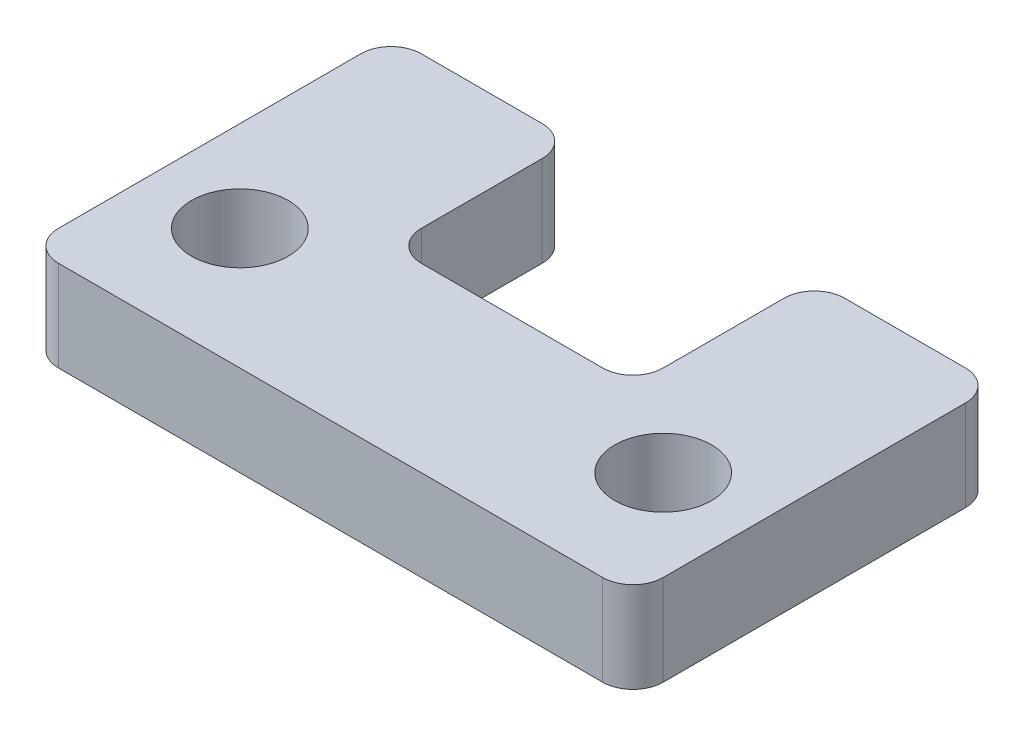
ISO-10303-21;
HEADER;
FILE_DESCRIPTION(('STEP AP214'),'2;1');
FILE_NAME('part.step','',(''),(''),'','','');
FILE_SCHEMA(('AUTOMOTIVE_DESIGN { 1 0 10303 214 1 1 1 1 }'));
ENDSEC;
DATA;
#1=APPLICATION_CONTEXT('core data for automotive mechanical design processes');
#2=APPLICATION_PROTOCOL_DEFINITION('international standard','automotive_design',2000,#1);
#3=PRODUCT_CONTEXT('',#1,'mechanical');
#4=PRODUCT('Part','Part','',(#3));
#5=PRODUCT_RELATED_PRODUCT_CATEGORY('part','',(#4));
#6=PRODUCT_DEFINITION_FORMATION('','',#4);
#7=PRODUCT_DEFINITION_CONTEXT('part definition',#1,'design');
#8=PRODUCT_DEFINITION('design','',#6,#7);
#9=PRODUCT_DEFINITION_SHAPE('','',#8);
#10=(LENGTH_UNIT() NAMED_UNIT(*) SI_UNIT(.MILLI.,.METRE.));
#11=(NAMED_UNIT(*) PLANE_ANGLE_UNIT() SI_UNIT($,.RADIAN.));
#12=(NAMED_UNIT(*) SI_UNIT($,.STERADIAN.) SOLID_ANGLE_UNIT());
#13=UNCERTAINTY_MEASURE_WITH_UNIT(LENGTH_MEASURE(1.E-05),#10,'distance_accuracy_value','');
#14=(GEOMETRIC_REPRESENTATION_CONTEXT(3) GLOBAL_UNCERTAINTY_ASSIGNED_CONTEXT((#13)) GLOBAL_UNIT_ASSIGNED_CONTEXT((#10,
#11,#12)) REPRESENTATION_CONTEXT('',''));
#15=CARTESIAN_POINT('',(0.,0.,0.));
#16=DIRECTION('',(0.,0.,1.));
#17=DIRECTION('',(1.,0.,0.));
#18=AXIS2_PLACEMENT_3D('',#15,#16,#17);
#19=CARTESIAN_POINT('',(0.,3.,0.));
#20=DIRECTION('',(0.,-1.,0.));
#21=DIRECTION('',(0.,0.,-1.));
#22=AXIS2_PLACEMENT_3D('',#19,#20,#21);
#23=PLANE('',#22);
#24=DIRECTION('',(0.,0.,-1.));
#25=VECTOR('',#24,1.);
#26=CARTESIAN_POINT('',(-4.,3.,-12.));
#27=LINE('',#26,#25);
#28=CARTESIAN_POINT('',(-4.,3.,-7.00000000000001));
#29=VERTEX_POINT('',#28);
#30=CARTESIAN_POINT('',(-4.,3.,-11.));
#31=VERTEX_POINT('',#30);
#32=EDGE_CURVE('E186',#29,#31,#27,.T.);
#33=ORIENTED_EDGE('',*,*,#32,.T.);
#34=CARTESIAN_POINT('',(-5.,3.,-11.));
#35=DIRECTION('',(0.,-1.,0.));
#36=DIRECTION('',(0.,0.,-1.));
#37=AXIS2_PLACEMENT_3D('',#34,#35,#36);
#38=CIRCLE('',#37,1.);
#39=CARTESIAN_POINT('',(-5.,3.,-12.));
#40=VERTEX_POINT('',#39);
#41=EDGE_CURVE('E225',#31,#40,#38,.F.);
#42=ORIENTED_EDGE('',*,*,#41,.T.);
#43=DIRECTION('',(-1.,0.,0.));
#44=VECTOR('',#43,1.);
#45=CARTESIAN_POINT('',(-10.,3.,-12.));
#46=LINE('',#45,#44);
#47=CARTESIAN_POINT('',(-9.,3.,-12.));
#48=VERTEX_POINT('',#47);
#49=EDGE_CURVE('E168',#40,#48,#46,.T.);
#50=ORIENTED_EDGE('',*,*,#49,.T.);
#51=CARTESIAN_POINT('',(-9.,3.,-11.));
#52=DIRECTION('',(0.,-1.,0.));
#53=DIRECTION('',(0.,0.,-1.));
#54=AXIS2_PLACEMENT_3D('',#51,#52,#53);
#55=CIRCLE('',#54,1.);
#56=CARTESIAN_POINT('',(-10.,3.,-11.));
#57=VERTEX_POINT('',#56);
#58=EDGE_CURVE('E217',#48,#57,#55,.F.);
#59=ORIENTED_EDGE('',*,*,#58,.T.);
#60=DIRECTION('',(0.,0.,1.));
#61=VECTOR('',#60,1.);
#62=CARTESIAN_POINT('',(-10.,3.,0.));
#63=LINE('',#62,#61);
#64=CARTESIAN_POINT('',(-10.,3.,-0.999999999999997));
#65=VERTEX_POINT('',#64);
#66=EDGE_CURVE('E285',#57,#65,#63,.T.);
#67=ORIENTED_EDGE('',*,*,#66,.T.);
#68=CARTESIAN_POINT('',(-9.,3.,-0.999999999999998));
#69=DIRECTION('',(0.,-1.,0.));
#70=DIRECTION('',(0.,0.,-1.));
#71=AXIS2_PLACEMENT_3D('',#68,#69,#70);
#72=CIRCLE('',#71,1.);
#73=CARTESIAN_POINT('',(-9.,3.,0.));
#74=VERTEX_POINT('',#73);
#75=EDGE_CURVE('E219',#65,#74,#72,.F.);
#76=ORIENTED_EDGE('',*,*,#75,.T.);
#77=DIRECTION('',(1.,0.,0.));
#78=VECTOR('',#77,1.);
#79=CARTESIAN_POINT('',(-10.,3.,0.));
#80=LINE('',#79,#78);
#81=CARTESIAN_POINT('',(9.00000000000001,3.,0.));
#82=VERTEX_POINT('',#81);
#83=EDGE_CURVE('E282',#74,#82,#80,.T.);
#84=ORIENTED_EDGE('',*,*,#83,.T.);
#85=CARTESIAN_POINT('',(9.00000000000001,3.,-1.));
#86=DIRECTION('',(0.,-1.,0.));
#87=DIRECTION('',(0.,0.,-1.));
#88=AXIS2_PLACEMENT_3D('',#85,#86,#87);
#89=CIRCLE('',#88,1.);
#90=CARTESIAN_POINT('',(10.,3.,-0.999999999999999));
#91=VERTEX_POINT('',#90);
#92=EDGE_CURVE('E215',#82,#91,#89,.F.);
#93=ORIENTED_EDGE('',*,*,#92,.T.);
#94=DIRECTION('',(0.,0.,-1.));
#95=VECTOR('',#94,1.);
#96=CARTESIAN_POINT('',(10.,3.,0.));
#97=LINE('',#96,#95);
#98=CARTESIAN_POINT('',(10.,3.,-11.));
#99=VERTEX_POINT('',#98);
#100=EDGE_CURVE('E279',#91,#99,#97,.T.);
#101=ORIENTED_EDGE('',*,*,#100,.T.);
#102=CARTESIAN_POINT('',(9.00000000000001,3.,-11.));
#103=DIRECTION('',(0.,-1.,0.));
#104=DIRECTION('',(0.,0.,-1.));
#105=AXIS2_PLACEMENT_3D('',#102,#103,#104);
#106=CIRCLE('',#105,1.);
#107=CARTESIAN_POINT('',(9.00000000000001,3.,-12.));
#108=VERTEX_POINT('',#107);
#109=EDGE_CURVE('E221',#99,#108,#106,.F.);
#110=ORIENTED_EDGE('',*,*,#109,.T.);
#111=DIRECTION('',(-1.,0.,0.));
#112=VECTOR('',#111,1.);
#113=CARTESIAN_POINT('',(10.,3.,-12.));
#114=LINE('',#113,#112);
#115=CARTESIAN_POINT('',(5.,3.,-12.));
#116=VERTEX_POINT('',#115);
#117=EDGE_CURVE('E274',#108,#116,#114,.T.);
#118=ORIENTED_EDGE('',*,*,#117,.T.);
#119=CARTESIAN_POINT('',(5.,3.,-11.));
#120=DIRECTION('',(0.,-1.,0.));
#121=DIRECTION('',(0.,0.,-1.));
#122=AXIS2_PLACEMENT_3D('',#119,#120,#121);
#123=CIRCLE('',#122,1.);
#124=CARTESIAN_POINT('',(4.,3.,-11.));
#125=VERTEX_POINT('',#124);
#126=EDGE_CURVE('E223',#116,#125,#123,.F.);
#127=ORIENTED_EDGE('',*,*,#126,.T.);
#128=DIRECTION('',(0.,0.,1.));
#129=VECTOR('',#128,1.);
#130=CARTESIAN_POINT('',(4.,3.,-12.));
#131=LINE('',#130,#129);
#132=CARTESIAN_POINT('',(4.,3.,-7.00000000000001));
#133=VERTEX_POINT('',#132);
#134=EDGE_CURVE('E272',#125,#133,#131,.T.);
#135=ORIENTED_EDGE('',*,*,#134,.T.);
#136=CARTESIAN_POINT('',(3.,3.,-7.00000000000001));
#137=DIRECTION('',(0.,-1.,0.));
#138=DIRECTION('',(0.,0.,-1.));
#139=AXIS2_PLACEMENT_3D('',#136,#137,#138);
#140=CIRCLE('',#139,1.);
#141=CARTESIAN_POINT('',(3.,3.,-6.00000000000001));
#142=VERTEX_POINT('',#141);
#143=EDGE_CURVE('E11',#133,#142,#140,.T.);
#144=ORIENTED_EDGE('',*,*,#143,.T.);
#145=DIRECTION('',(-1.,0.,0.));
#146=VECTOR('',#145,1.);
#147=CARTESIAN_POINT('',(4.,3.,-6.00000000000001));
#148=LINE('',#147,#146);
#149=CARTESIAN_POINT('',(-3.,3.,-6.00000000000001));
#150=VERTEX_POINT('',#149);
#151=EDGE_CURVE('E270',#142,#150,#148,.T.);
#152=ORIENTED_EDGE('',*,*,#151,.T.);
#153=CARTESIAN_POINT('',(-3.,3.,-7.00000000000001));
#154=DIRECTION('',(0.,-1.,0.));
#155=DIRECTION('',(0.,0.,-1.));
#156=AXIS2_PLACEMENT_3D('',#153,#154,#155);
#157=CIRCLE('',#156,1.);
#158=EDGE_CURVE('E258',#150,#29,#157,.T.);
#159=ORIENTED_EDGE('',*,*,#158,.T.);
#160=EDGE_LOOP('',(#33,#42,#50,#59,#67,#76,#84,#93,#101,#110,#118,#127,#135,#144,#152,#159));
#161=FACE_BOUND('',#160,.T.);
#162=CARTESIAN_POINT('',(7.,3.,-4.00000000000001));
#163=DIRECTION('',(0.,1.,0.));
#164=DIRECTION('',(0.,0.,1.));
#165=AXIS2_PLACEMENT_3D('',#162,#163,#164);
#166=CIRCLE('',#165,1.6);
#167=CARTESIAN_POINT('',(7.,3.,-2.40000000000001));
#168=VERTEX_POINT('',#167);
#169=EDGE_CURVE('E177',#168,#168,#166,.T.);
#170=ORIENTED_EDGE('',*,*,#169,.F.);
#171=EDGE_LOOP('',(#170));
#172=FACE_BOUND('',#171,.T.);
#173=CARTESIAN_POINT('',(-7.,3.,-4.00000000000001));
#174=DIRECTION('',(0.,1.,0.));
#175=DIRECTION('',(0.,0.,-1.));
#176=AXIS2_PLACEMENT_3D('',#173,#174,#175);
#177=CIRCLE('',#176,1.6);
#178=CARTESIAN_POINT('',(-7.,3.,-5.6));
#179=VERTEX_POINT('',#178);
#180=EDGE_CURVE('E290',#179,#179,#177,.T.);
#181=ORIENTED_EDGE('',*,*,#180,.F.);
#182=EDGE_LOOP('',(#181));
#183=FACE_BOUND('',#182,.T.);
#184=ADVANCED_FACE('F35',(#161,#172,#183),#23,.F.);
#185=CARTESIAN_POINT('',(0.,0.,0.));
#186=DIRECTION('',(0.,-1.,0.));
#187=DIRECTION('',(0.,0.,-1.));
#188=AXIS2_PLACEMENT_3D('',#185,#186,#187);
#189=PLANE('',#188);
#190=CARTESIAN_POINT('',(7.,0.,-4.00000000000001));
#191=DIRECTION('',(0.,1.,0.));
#192=DIRECTION('',(0.,0.,1.));
#193=AXIS2_PLACEMENT_3D('',#190,#191,#192);
#194=CIRCLE('',#193,1.6);
#195=CARTESIAN_POINT('',(7.,0.,-2.40000000000001));
#196=VERTEX_POINT('',#195);
#197=EDGE_CURVE('E183',#196,#196,#194,.T.);
#198=ORIENTED_EDGE('',*,*,#197,.T.);
#199=EDGE_LOOP('',(#198));
#200=FACE_BOUND('',#199,.T.);
#201=DIRECTION('',(-1.,0.,0.));
#202=VECTOR('',#201,1.);
#203=CARTESIAN_POINT('',(-10.,0.,-12.));
#204=LINE('',#203,#202);
#205=CARTESIAN_POINT('',(-5.,0.,-12.));
#206=VERTEX_POINT('',#205);
#207=CARTESIAN_POINT('',(-9.,0.,-12.));
#208=VERTEX_POINT('',#207);
#209=EDGE_CURVE('E165',#206,#208,#204,.T.);
#210=ORIENTED_EDGE('',*,*,#209,.F.);
#211=CARTESIAN_POINT('',(-5.,0.,-11.));
#212=DIRECTION('',(0.,-1.,0.));
#213=DIRECTION('',(0.,0.,-1.));
#214=AXIS2_PLACEMENT_3D('',#211,#212,#213);
#215=CIRCLE('',#214,1.);
#216=CARTESIAN_POINT('',(-4.,0.,-11.));
#217=VERTEX_POINT('',#216);
#218=EDGE_CURVE('E148',#206,#217,#215,.T.);
#219=ORIENTED_EDGE('',*,*,#218,.T.);
#220=DIRECTION('',(0.,0.,-1.));
#221=VECTOR('',#220,1.);
#222=CARTESIAN_POINT('',(-4.,0.,-12.));
#223=LINE('',#222,#221);
#224=CARTESIAN_POINT('',(-4.,0.,-7.00000000000001));
#225=VERTEX_POINT('',#224);
#226=EDGE_CURVE('E202',#225,#217,#223,.T.);
#227=ORIENTED_EDGE('',*,*,#226,.F.);
#228=CARTESIAN_POINT('',(-3.,0.,-7.00000000000001));
#229=DIRECTION('',(0.,-1.,0.));
#230=DIRECTION('',(0.,0.,-1.));
#231=AXIS2_PLACEMENT_3D('',#228,#229,#230);
#232=CIRCLE('',#231,1.);
#233=CARTESIAN_POINT('',(-3.,0.,-6.00000000000001));
#234=VERTEX_POINT('',#233);
#235=EDGE_CURVE('E256',#225,#234,#232,.F.);
#236=ORIENTED_EDGE('',*,*,#235,.T.);
#237=DIRECTION('',(-1.,0.,0.));
#238=VECTOR('',#237,1.);
#239=CARTESIAN_POINT('',(4.,0.,-6.00000000000001));
#240=LINE('',#239,#238);
#241=CARTESIAN_POINT('',(3.,0.,-6.00000000000001));
#242=VERTEX_POINT('',#241);
#243=EDGE_CURVE('E200',#242,#234,#240,.T.);
#244=ORIENTED_EDGE('',*,*,#243,.F.);
#245=CARTESIAN_POINT('',(3.,0.,-7.00000000000001));
#246=DIRECTION('',(0.,-1.,0.));
#247=DIRECTION('',(0.,0.,-1.));
#248=AXIS2_PLACEMENT_3D('',#245,#246,#247);
#249=CIRCLE('',#248,1.);
#250=CARTESIAN_POINT('',(4.,0.,-7.00000000000001));
#251=VERTEX_POINT('',#250);
#252=EDGE_CURVE('E43',#242,#251,#249,.F.);
#253=ORIENTED_EDGE('',*,*,#252,.T.);
#254=DIRECTION('',(0.,0.,1.));
#255=VECTOR('',#254,1.);
#256=CARTESIAN_POINT('',(4.,0.,-12.));
#257=LINE('',#256,#255);
#258=CARTESIAN_POINT('',(4.,0.,-11.));
#259=VERTEX_POINT('',#258);
#260=EDGE_CURVE('E197',#259,#251,#257,.T.);
#261=ORIENTED_EDGE('',*,*,#260,.F.);
#262=CARTESIAN_POINT('',(5.,0.,-11.));
#263=DIRECTION('',(0.,-1.,0.));
#264=DIRECTION('',(0.,0.,-1.));
#265=AXIS2_PLACEMENT_3D('',#262,#263,#264);
#266=CIRCLE('',#265,1.);
#267=CARTESIAN_POINT('',(5.,0.,-12.));
#268=VERTEX_POINT('',#267);
#269=EDGE_CURVE('E159',#259,#268,#266,.T.);
#270=ORIENTED_EDGE('',*,*,#269,.T.);
#271=DIRECTION('',(-1.,0.,0.));
#272=VECTOR('',#271,1.);
#273=CARTESIAN_POINT('',(10.,0.,-12.));
#274=LINE('',#273,#272);
#275=CARTESIAN_POINT('',(9.00000000000001,0.,-12.));
#276=VERTEX_POINT('',#275);
#277=EDGE_CURVE('E194',#276,#268,#274,.T.);
#278=ORIENTED_EDGE('',*,*,#277,.F.);
#279=CARTESIAN_POINT('',(9.00000000000001,0.,-11.));
#280=DIRECTION('',(0.,-1.,0.));
#281=DIRECTION('',(0.,0.,-1.));
#282=AXIS2_PLACEMENT_3D('',#279,#280,#281);
#283=CIRCLE('',#282,1.);
#284=CARTESIAN_POINT('',(10.,0.,-11.));
#285=VERTEX_POINT('',#284);
#286=EDGE_CURVE('E209',#276,#285,#283,.T.);
#287=ORIENTED_EDGE('',*,*,#286,.T.);
#288=DIRECTION('',(0.,0.,-1.));
#289=VECTOR('',#288,1.);
#290=CARTESIAN_POINT('',(10.,0.,0.));
#291=LINE('',#290,#289);
#292=CARTESIAN_POINT('',(10.,0.,-0.999999999999999));
#293=VERTEX_POINT('',#292);
#294=EDGE_CURVE('E191',#293,#285,#291,.T.);
#295=ORIENTED_EDGE('',*,*,#294,.F.);
#296=CARTESIAN_POINT('',(9.00000000000001,0.,-1.));
#297=DIRECTION('',(0.,-1.,0.));
#298=DIRECTION('',(0.,0.,-1.));
#299=AXIS2_PLACEMENT_3D('',#296,#297,#298);
#300=CIRCLE('',#299,1.);
#301=CARTESIAN_POINT('',(9.00000000000001,0.,0.));
#302=VERTEX_POINT('',#301);
#303=EDGE_CURVE('E169',#293,#302,#300,.T.);
#304=ORIENTED_EDGE('',*,*,#303,.T.);
#305=DIRECTION('',(1.,0.,0.));
#306=VECTOR('',#305,1.);
#307=CARTESIAN_POINT('',(-10.,0.,0.));
#308=LINE('',#307,#306);
#309=CARTESIAN_POINT('',(-9.,0.,0.));
#310=VERTEX_POINT('',#309);
#311=EDGE_CURVE('E180',#310,#302,#308,.T.);
#312=ORIENTED_EDGE('',*,*,#311,.F.);
#313=CARTESIAN_POINT('',(-9.,0.,-0.999999999999998));
#314=DIRECTION('',(0.,-1.,0.));
#315=DIRECTION('',(0.,0.,-1.));
#316=AXIS2_PLACEMENT_3D('',#313,#314,#315);
#317=CIRCLE('',#316,1.);
#318=CARTESIAN_POINT('',(-10.,0.,-0.999999999999997));
#319=VERTEX_POINT('',#318);
#320=EDGE_CURVE('E207',#310,#319,#317,.T.);
#321=ORIENTED_EDGE('',*,*,#320,.T.);
#322=DIRECTION('',(0.,0.,1.));
#323=VECTOR('',#322,1.);
#324=CARTESIAN_POINT('',(-10.,0.,0.));
#325=LINE('',#324,#323);
#326=CARTESIAN_POINT('',(-10.,0.,-11.));
#327=VERTEX_POINT('',#326);
#328=EDGE_CURVE('E176',#327,#319,#325,.T.);
#329=ORIENTED_EDGE('',*,*,#328,.F.);
#330=CARTESIAN_POINT('',(-9.,0.,-11.));
#331=DIRECTION('',(0.,-1.,0.));
#332=DIRECTION('',(0.,0.,-1.));
#333=AXIS2_PLACEMENT_3D('',#330,#331,#332);
#334=CIRCLE('',#333,1.);
#335=EDGE_CURVE('E175',#327,#208,#334,.T.);
#336=ORIENTED_EDGE('',*,*,#335,.T.);
#337=EDGE_LOOP('',(#210,#219,#227,#236,#244,#253,#261,#270,#278,#287,#295,#304,#312,#321,#329,#336));
#338=FACE_BOUND('',#337,.T.);
#339=CARTESIAN_POINT('',(-7.,0.,-4.00000000000001));
#340=DIRECTION('',(0.,1.,0.));
#341=DIRECTION('',(0.,0.,-1.));
#342=AXIS2_PLACEMENT_3D('',#339,#340,#341);
#343=CIRCLE('',#342,1.6);
#344=CARTESIAN_POINT('',(-7.,0.,-5.6));
#345=VERTEX_POINT('',#344);
#346=EDGE_CURVE('E292',#345,#345,#343,.T.);
#347=ORIENTED_EDGE('',*,*,#346,.T.);
#348=EDGE_LOOP('',(#347));
#349=FACE_BOUND('',#348,.T.);
#350=ADVANCED_FACE('F172',(#200,#338,#349),#189,.T.);
#351=CARTESIAN_POINT('',(-10.,3.,-12.));
#352=DIRECTION('',(0.,0.,1.));
#353=DIRECTION('',(1.,0.,0.));
#354=AXIS2_PLACEMENT_3D('',#351,#352,#353);
#355=PLANE('',#354);
#356=ORIENTED_EDGE('',*,*,#49,.F.);
#357=DIRECTION('',(0.,-1.,0.));
#358=VECTOR('',#357,1.);
#359=CARTESIAN_POINT('',(-5.,3.,-12.));
#360=LINE('',#359,#358);
#361=EDGE_CURVE('E152',#40,#206,#360,.T.);
#362=ORIENTED_EDGE('',*,*,#361,.T.);
#363=ORIENTED_EDGE('',*,*,#209,.T.);
#364=DIRECTION('',(0.,-1.,0.));
#365=VECTOR('',#364,1.);
#366=CARTESIAN_POINT('',(-9.,3.,-12.));
#367=LINE('',#366,#365);
#368=EDGE_CURVE('E170',#208,#48,#367,.F.);
#369=ORIENTED_EDGE('',*,*,#368,.T.);
#370=EDGE_LOOP('',(#356,#362,#363,#369));
#371=FACE_BOUND('',#370,.T.);
#372=ADVANCED_FACE('F164',(#371),#355,.F.);
#373=CARTESIAN_POINT('',(-10.,3.,0.));
#374=DIRECTION('',(1.,0.,0.));
#375=DIRECTION('',(0.,0.,-1.));
#376=AXIS2_PLACEMENT_3D('',#373,#374,#375);
#377=PLANE('',#376);
#378=ORIENTED_EDGE('',*,*,#328,.T.);
#379=DIRECTION('',(0.,-1.,0.));
#380=VECTOR('',#379,1.);
#381=CARTESIAN_POINT('',(-10.,3.,-0.999999999999997));
#382=LINE('',#381,#380);
#383=EDGE_CURVE('E254',#319,#65,#382,.F.);
#384=ORIENTED_EDGE('',*,*,#383,.T.);
#385=ORIENTED_EDGE('',*,*,#66,.F.);
#386=DIRECTION('',(0.,-1.,0.));
#387=VECTOR('',#386,1.);
#388=CARTESIAN_POINT('',(-10.,3.,-11.));
#389=LINE('',#388,#387);
#390=EDGE_CURVE('E251',#57,#327,#389,.T.);
#391=ORIENTED_EDGE('',*,*,#390,.T.);
#392=EDGE_LOOP('',(#378,#384,#385,#391));
#393=FACE_BOUND('',#392,.T.);
#394=ADVANCED_FACE('F332',(#393),#377,.F.);
#395=CARTESIAN_POINT('',(-10.,3.,0.));
#396=DIRECTION('',(0.,0.,-1.));
#397=DIRECTION('',(-1.,0.,0.));
#398=AXIS2_PLACEMENT_3D('',#395,#396,#397);
#399=PLANE('',#398);
#400=ORIENTED_EDGE('',*,*,#83,.F.);
#401=DIRECTION('',(0.,-1.,0.));
#402=VECTOR('',#401,1.);
#403=CARTESIAN_POINT('',(-9.,3.,0.));
#404=LINE('',#403,#402);
#405=EDGE_CURVE('E248',#74,#310,#404,.T.);
#406=ORIENTED_EDGE('',*,*,#405,.T.);
#407=ORIENTED_EDGE('',*,*,#311,.T.);
#408=DIRECTION('',(0.,-1.,0.));
#409=VECTOR('',#408,1.);
#410=CARTESIAN_POINT('',(9.00000000000001,3.,0.));
#411=LINE('',#410,#409);
#412=EDGE_CURVE('E246',#302,#82,#411,.F.);
#413=ORIENTED_EDGE('',*,*,#412,.T.);
#414=EDGE_LOOP('',(#400,#406,#407,#413));
#415=FACE_BOUND('',#414,.T.);
#416=ADVANCED_FACE('F328',(#415),#399,.F.);
#417=CARTESIAN_POINT('',(10.,3.,0.));
#418=DIRECTION('',(-1.,0.,0.));
#419=DIRECTION('',(0.,0.,1.));
#420=AXIS2_PLACEMENT_3D('',#417,#418,#419);
#421=PLANE('',#420);
#422=ORIENTED_EDGE('',*,*,#294,.T.);
#423=DIRECTION('',(0.,-1.,0.));
#424=VECTOR('',#423,1.);
#425=CARTESIAN_POINT('',(10.,3.,-11.));
#426=LINE('',#425,#424);
#427=EDGE_CURVE('E244',#285,#99,#426,.F.);
#428=ORIENTED_EDGE('',*,*,#427,.T.);
#429=ORIENTED_EDGE('',*,*,#100,.F.);
#430=DIRECTION('',(0.,-1.,0.));
#431=VECTOR('',#430,1.);
#432=CARTESIAN_POINT('',(10.,3.,-1.));
#433=LINE('',#432,#431);
#434=EDGE_CURVE('E241',#91,#293,#433,.T.);
#435=ORIENTED_EDGE('',*,*,#434,.T.);
#436=EDGE_LOOP('',(#422,#428,#429,#435));
#437=FACE_BOUND('',#436,.T.);
#438=ADVANCED_FACE('F324',(#437),#421,.F.);
#439=CARTESIAN_POINT('',(10.,3.,-12.));
#440=DIRECTION('',(0.,0.,1.));
#441=DIRECTION('',(1.,0.,0.));
#442=AXIS2_PLACEMENT_3D('',#439,#440,#441);
#443=PLANE('',#442);
#444=ORIENTED_EDGE('',*,*,#277,.T.);
#445=DIRECTION('',(0.,-1.,0.));
#446=VECTOR('',#445,1.);
#447=CARTESIAN_POINT('',(5.,3.,-12.));
#448=LINE('',#447,#446);
#449=EDGE_CURVE('E239',#268,#116,#448,.F.);
#450=ORIENTED_EDGE('',*,*,#449,.T.);
#451=ORIENTED_EDGE('',*,*,#117,.F.);
#452=DIRECTION('',(0.,-1.,0.));
#453=VECTOR('',#452,1.);
#454=CARTESIAN_POINT('',(9.00000000000001,3.,-12.));
#455=LINE('',#454,#453);
#456=EDGE_CURVE('E236',#108,#276,#455,.T.);
#457=ORIENTED_EDGE('',*,*,#456,.T.);
#458=EDGE_LOOP('',(#444,#450,#451,#457));
#459=FACE_BOUND('',#458,.T.);
#460=ADVANCED_FACE('F321',(#459),#443,.F.);
#461=CARTESIAN_POINT('',(4.,3.,-12.));
#462=DIRECTION('',(1.,0.,0.));
#463=DIRECTION('',(0.,0.,-1.));
#464=AXIS2_PLACEMENT_3D('',#461,#462,#463);
#465=PLANE('',#464);
#466=ORIENTED_EDGE('',*,*,#260,.T.);
#467=DIRECTION('',(0.,-1.,0.));
#468=VECTOR('',#467,1.);
#469=CARTESIAN_POINT('',(4.,3.,-7.00000000000001));
#470=LINE('',#469,#468);
#471=EDGE_CURVE('E234',#251,#133,#470,.F.);
#472=ORIENTED_EDGE('',*,*,#471,.T.);
#473=ORIENTED_EDGE('',*,*,#134,.F.);
#474=DIRECTION('',(0.,-1.,0.));
#475=VECTOR('',#474,1.);
#476=CARTESIAN_POINT('',(4.,3.,-11.));
#477=LINE('',#476,#475);
#478=EDGE_CURVE('E231',#125,#259,#477,.T.);
#479=ORIENTED_EDGE('',*,*,#478,.T.);
#480=EDGE_LOOP('',(#466,#472,#473,#479));
#481=FACE_BOUND('',#480,.T.);
#482=ADVANCED_FACE('F265',(#481),#465,.F.);
#483=CARTESIAN_POINT('',(4.,3.,-6.00000000000001));
#484=DIRECTION('',(0.,0.,1.));
#485=DIRECTION('',(1.,0.,0.));
#486=AXIS2_PLACEMENT_3D('',#483,#484,#485);
#487=PLANE('',#486);
#488=ORIENTED_EDGE('',*,*,#243,.T.);
#489=DIRECTION('',(0.,-1.,0.));
#490=VECTOR('',#489,1.);
#491=CARTESIAN_POINT('',(-3.,3.,-6.00000000000001));
#492=LINE('',#491,#490);
#493=EDGE_CURVE('E50',#234,#150,#492,.F.);
#494=ORIENTED_EDGE('',*,*,#493,.T.);
#495=ORIENTED_EDGE('',*,*,#151,.F.);
#496=DIRECTION('',(0.,-1.,0.));
#497=VECTOR('',#496,1.);
#498=CARTESIAN_POINT('',(3.,0.,-6.00000000000001));
#499=LINE('',#498,#497);
#500=EDGE_CURVE('E227',#142,#242,#499,.T.);
#501=ORIENTED_EDGE('',*,*,#500,.T.);
#502=EDGE_LOOP('',(#488,#494,#495,#501));
#503=FACE_BOUND('',#502,.T.);
#504=ADVANCED_FACE('F269',(#503),#487,.F.);
#505=CARTESIAN_POINT('',(-4.,3.,-12.));
#506=DIRECTION('',(-1.,0.,0.));
#507=DIRECTION('',(0.,0.,1.));
#508=AXIS2_PLACEMENT_3D('',#505,#506,#507);
#509=PLANE('',#508);
#510=ORIENTED_EDGE('',*,*,#226,.T.);
#511=DIRECTION('',(0.,-1.,0.));
#512=VECTOR('',#511,1.);
#513=CARTESIAN_POINT('',(-4.,3.,-11.));
#514=LINE('',#513,#512);
#515=EDGE_CURVE('E153',#217,#31,#514,.F.);
#516=ORIENTED_EDGE('',*,*,#515,.T.);
#517=ORIENTED_EDGE('',*,*,#32,.F.);
#518=DIRECTION('',(0.,-1.,0.));
#519=VECTOR('',#518,1.);
#520=CARTESIAN_POINT('',(-4.,0.,-7.00000000000001));
#521=LINE('',#520,#519);
#522=EDGE_CURVE('E158',#29,#225,#521,.T.);
#523=ORIENTED_EDGE('',*,*,#522,.T.);
#524=EDGE_LOOP('',(#510,#516,#517,#523));
#525=FACE_BOUND('',#524,.T.);
#526=ADVANCED_FACE('F313',(#525),#509,.F.);
#527=CARTESIAN_POINT('',(7.,3.,-4.00000000000001));
#528=DIRECTION('',(0.,-1.,0.));
#529=DIRECTION('',(0.,0.,-1.));
#530=AXIS2_PLACEMENT_3D('',#527,#528,#529);
#531=CYLINDRICAL_SURFACE('',#530,1.6);
#532=ORIENTED_EDGE('',*,*,#169,.T.);
#533=EDGE_LOOP('',(#532));
#534=FACE_BOUND('',#533,.T.);
#535=ORIENTED_EDGE('',*,*,#197,.F.);
#536=EDGE_LOOP('',(#535));
#537=FACE_BOUND('',#536,.T.);
#538=ADVANCED_FACE('F310',(#534,#537),#531,.F.);
#539=CARTESIAN_POINT('',(-7.,3.,-4.00000000000001));
#540=DIRECTION('',(0.,-1.,0.));
#541=DIRECTION('',(0.,0.,-1.));
#542=AXIS2_PLACEMENT_3D('',#539,#540,#541);
#543=CYLINDRICAL_SURFACE('',#542,1.6);
#544=ORIENTED_EDGE('',*,*,#180,.T.);
#545=EDGE_LOOP('',(#544));
#546=FACE_BOUND('',#545,.T.);
#547=ORIENTED_EDGE('',*,*,#346,.F.);
#548=EDGE_LOOP('',(#547));
#549=FACE_BOUND('',#548,.T.);
#550=ADVANCED_FACE('F298',(#546,#549),#543,.F.);
#551=CARTESIAN_POINT('',(-5.,3.,-11.));
#552=DIRECTION('',(0.,-1.,0.));
#553=DIRECTION('',(0.,0.,-1.));
#554=AXIS2_PLACEMENT_3D('',#551,#552,#553);
#555=CYLINDRICAL_SURFACE('',#554,1.);
#556=ORIENTED_EDGE('',*,*,#41,.F.);
#557=ORIENTED_EDGE('',*,*,#515,.F.);
#558=ORIENTED_EDGE('',*,*,#218,.F.);
#559=ORIENTED_EDGE('',*,*,#361,.F.);
#560=EDGE_LOOP('',(#556,#557,#558,#559));
#561=FACE_BOUND('',#560,.T.);
#562=ADVANCED_FACE('F151',(#561),#555,.T.);
#563=CARTESIAN_POINT('',(-3.,3.,-7.00000000000001));
#564=DIRECTION('',(0.,1.,0.));
#565=DIRECTION('',(0.,0.,1.));
#566=AXIS2_PLACEMENT_3D('',#563,#564,#565);
#567=CYLINDRICAL_SURFACE('',#566,1.);
#568=ORIENTED_EDGE('',*,*,#158,.F.);
#569=ORIENTED_EDGE('',*,*,#493,.F.);
#570=ORIENTED_EDGE('',*,*,#235,.F.);
#571=ORIENTED_EDGE('',*,*,#522,.F.);
#572=EDGE_LOOP('',(#568,#569,#570,#571));
#573=FACE_BOUND('',#572,.T.);
#574=ADVANCED_FACE('F341',(#573),#567,.F.);
#575=CARTESIAN_POINT('',(3.,3.,-7.00000000000001));
#576=DIRECTION('',(0.,1.,0.));
#577=DIRECTION('',(0.,0.,1.));
#578=AXIS2_PLACEMENT_3D('',#575,#576,#577);
#579=CYLINDRICAL_SURFACE('',#578,1.);
#580=ORIENTED_EDGE('',*,*,#143,.F.);
#581=ORIENTED_EDGE('',*,*,#471,.F.);
#582=ORIENTED_EDGE('',*,*,#252,.F.);
#583=ORIENTED_EDGE('',*,*,#500,.F.);
#584=EDGE_LOOP('',(#580,#581,#582,#583));
#585=FACE_BOUND('',#584,.T.);
#586=ADVANCED_FACE('F268',(#585),#579,.F.);
#587=CARTESIAN_POINT('',(5.,3.,-11.));
#588=DIRECTION('',(0.,-1.,0.));
#589=DIRECTION('',(0.,0.,-1.));
#590=AXIS2_PLACEMENT_3D('',#587,#588,#589);
#591=CYLINDRICAL_SURFACE('',#590,1.);
#592=ORIENTED_EDGE('',*,*,#126,.F.);
#593=ORIENTED_EDGE('',*,*,#449,.F.);
#594=ORIENTED_EDGE('',*,*,#269,.F.);
#595=ORIENTED_EDGE('',*,*,#478,.F.);
#596=EDGE_LOOP('',(#592,#593,#594,#595));
#597=FACE_BOUND('',#596,.T.);
#598=ADVANCED_FACE('F347',(#597),#591,.T.);
#599=CARTESIAN_POINT('',(9.00000000000001,3.,-11.));
#600=DIRECTION('',(0.,-1.,0.));
#601=DIRECTION('',(0.,0.,-1.));
#602=AXIS2_PLACEMENT_3D('',#599,#600,#601);
#603=CYLINDRICAL_SURFACE('',#602,1.);
#604=ORIENTED_EDGE('',*,*,#109,.F.);
#605=ORIENTED_EDGE('',*,*,#427,.F.);
#606=ORIENTED_EDGE('',*,*,#286,.F.);
#607=ORIENTED_EDGE('',*,*,#456,.F.);
#608=EDGE_LOOP('',(#604,#605,#606,#607));
#609=FACE_BOUND('',#608,.T.);
#610=ADVANCED_FACE('F350',(#609),#603,.T.);
#611=CARTESIAN_POINT('',(-9.,3.,-0.999999999999998));
#612=DIRECTION('',(0.,-1.,0.));
#613=DIRECTION('',(0.,0.,-1.));
#614=AXIS2_PLACEMENT_3D('',#611,#612,#613);
#615=CYLINDRICAL_SURFACE('',#614,1.);
#616=ORIENTED_EDGE('',*,*,#75,.F.);
#617=ORIENTED_EDGE('',*,*,#383,.F.);
#618=ORIENTED_EDGE('',*,*,#320,.F.);
#619=ORIENTED_EDGE('',*,*,#405,.F.);
#620=EDGE_LOOP('',(#616,#617,#618,#619));
#621=FACE_BOUND('',#620,.T.);
#622=ADVANCED_FACE('F354',(#621),#615,.T.);
#623=CARTESIAN_POINT('',(-9.,3.,-11.));
#624=DIRECTION('',(0.,-1.,0.));
#625=DIRECTION('',(0.,0.,-1.));
#626=AXIS2_PLACEMENT_3D('',#623,#624,#625);
#627=CYLINDRICAL_SURFACE('',#626,1.);
#628=ORIENTED_EDGE('',*,*,#58,.F.);
#629=ORIENTED_EDGE('',*,*,#368,.F.);
#630=ORIENTED_EDGE('',*,*,#335,.F.);
#631=ORIENTED_EDGE('',*,*,#390,.F.);
#632=EDGE_LOOP('',(#628,#629,#630,#631));
#633=FACE_BOUND('',#632,.T.);
#634=ADVANCED_FACE('F357',(#633),#627,.T.);
#635=CARTESIAN_POINT('',(9.00000000000001,3.,-1.));
#636=DIRECTION('',(0.,-1.,0.));
#637=DIRECTION('',(0.,0.,-1.));
#638=AXIS2_PLACEMENT_3D('',#635,#636,#637);
#639=CYLINDRICAL_SURFACE('',#638,1.);
#640=ORIENTED_EDGE('',*,*,#92,.F.);
#641=ORIENTED_EDGE('',*,*,#412,.F.);
#642=ORIENTED_EDGE('',*,*,#303,.F.);
#643=ORIENTED_EDGE('',*,*,#434,.F.);
#644=EDGE_LOOP('',(#640,#641,#642,#643));
#645=FACE_BOUND('',#644,.T.);
#646=ADVANCED_FACE('F37',(#645),#639,.T.);
#647=CLOSED_SHELL('',(#184,#350,#372,#394,#416,#438,#460,#482,#504,#526,#538,#550,#562,#574,
#586,#598,#610,#622,#634,#646));
#648=MANIFOLD_SOLID_BREP('B2',#647);
#649=ADVANCED_BREP_SHAPE_REPRESENTATION('',(#18,#648),#14);
#650=SHAPE_DEFINITION_REPRESENTATION(#9,#649);
ENDSEC;
END-ISO-10303-21;
